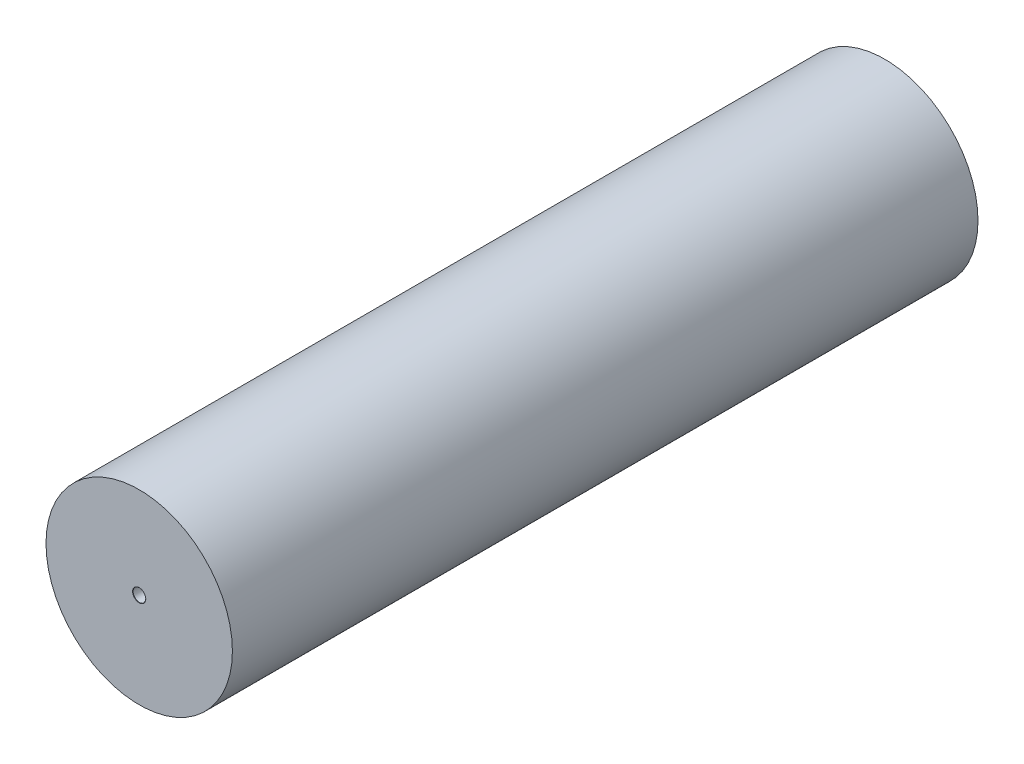
ISO-10303-21;
HEADER;
FILE_DESCRIPTION(('STEP AP214'),'2;1');
FILE_NAME('part.step','',(''),(''),'','','');
FILE_SCHEMA(('AUTOMOTIVE_DESIGN { 1 0 10303 214 1 1 1 1 }'));
ENDSEC;
DATA;
#1=APPLICATION_CONTEXT('core data for automotive mechanical design processes');
#2=APPLICATION_PROTOCOL_DEFINITION('international standard','automotive_design',2000,#1);
#3=PRODUCT_CONTEXT('',#1,'mechanical');
#4=PRODUCT('Part','Part','',(#3));
#5=PRODUCT_RELATED_PRODUCT_CATEGORY('part','',(#4));
#6=PRODUCT_DEFINITION_FORMATION('','',#4);
#7=PRODUCT_DEFINITION_CONTEXT('part definition',#1,'design');
#8=PRODUCT_DEFINITION('design','',#6,#7);
#9=PRODUCT_DEFINITION_SHAPE('','',#8);
#10=(LENGTH_UNIT() NAMED_UNIT(*) SI_UNIT(.MILLI.,.METRE.));
#11=(NAMED_UNIT(*) PLANE_ANGLE_UNIT() SI_UNIT($,.RADIAN.));
#12=(NAMED_UNIT(*) SI_UNIT($,.STERADIAN.) SOLID_ANGLE_UNIT());
#13=UNCERTAINTY_MEASURE_WITH_UNIT(LENGTH_MEASURE(1.E-05),#10,'distance_accuracy_value','');
#14=(GEOMETRIC_REPRESENTATION_CONTEXT(3) GLOBAL_UNCERTAINTY_ASSIGNED_CONTEXT((#13)) GLOBAL_UNIT_ASSIGNED_CONTEXT((#10,
#11,#12)) REPRESENTATION_CONTEXT('',''));
#15=CARTESIAN_POINT('',(0.,0.,0.));
#16=DIRECTION('',(0.,0.,1.));
#17=DIRECTION('',(1.,0.,0.));
#18=AXIS2_PLACEMENT_3D('',#15,#16,#17);
#19=CARTESIAN_POINT('',(0.,0.,1016.));
#20=DIRECTION('',(0.,0.,-1.));
#21=DIRECTION('',(-1.,0.,0.));
#22=AXIS2_PLACEMENT_3D('',#19,#20,#21);
#23=CYLINDRICAL_SURFACE('',#22,127.);
#24=CARTESIAN_POINT('',(0.,0.,1016.));
#25=DIRECTION('',(0.,0.,1.));
#26=DIRECTION('',(1.,0.,0.));
#27=AXIS2_PLACEMENT_3D('',#24,#25,#26);
#28=CIRCLE('',#27,127.);
#29=CARTESIAN_POINT('',(127.,0.,1016.));
#30=VERTEX_POINT('',#29);
#31=EDGE_CURVE('E10',#30,#30,#28,.T.);
#32=ORIENTED_EDGE('',*,*,#31,.F.);
#33=EDGE_LOOP('',(#32));
#34=FACE_BOUND('',#33,.T.);
#35=CARTESIAN_POINT('',(0.,0.,0.));
#36=DIRECTION('',(0.,0.,1.));
#37=DIRECTION('',(1.,0.,0.));
#38=AXIS2_PLACEMENT_3D('',#35,#36,#37);
#39=CIRCLE('',#38,127.);
#40=CARTESIAN_POINT('',(127.,0.,0.));
#41=VERTEX_POINT('',#40);
#42=EDGE_CURVE('E38',#41,#41,#39,.T.);
#43=ORIENTED_EDGE('',*,*,#42,.T.);
#44=EDGE_LOOP('',(#43));
#45=FACE_BOUND('',#44,.T.);
#46=ADVANCED_FACE('F35',(#34,#45),#23,.T.);
#47=CARTESIAN_POINT('',(0.,0.,1016.));
#48=DIRECTION('',(0.,0.,1.));
#49=DIRECTION('',(1.,0.,0.));
#50=AXIS2_PLACEMENT_3D('',#47,#48,#49);
#51=PLANE('',#50);
#52=CARTESIAN_POINT('',(0.,2.35351280787324,1016.));
#53=DIRECTION('',(0.,0.,1.));
#54=DIRECTION('',(1.,0.,0.));
#55=AXIS2_PLACEMENT_3D('',#52,#53,#54);
#56=CIRCLE('',#55,8.955);
#57=CARTESIAN_POINT('',(8.955,2.35351280787324,1016.));
#58=VERTEX_POINT('',#57);
#59=EDGE_CURVE('E58',#58,#58,#56,.T.);
#60=ORIENTED_EDGE('',*,*,#59,.F.);
#61=EDGE_LOOP('',(#60));
#62=FACE_BOUND('',#61,.T.);
#63=ORIENTED_EDGE('',*,*,#31,.T.);
#64=EDGE_LOOP('',(#63));
#65=FACE_BOUND('',#64,.T.);
#66=ADVANCED_FACE('F64',(#62,#65),#51,.T.);
#67=CARTESIAN_POINT('',(0.,0.,0.));
#68=DIRECTION('',(0.,0.,1.));
#69=DIRECTION('',(1.,0.,0.));
#70=AXIS2_PLACEMENT_3D('',#67,#68,#69);
#71=PLANE('',#70);
#72=CARTESIAN_POINT('',(0.,2.35351280787324,0.));
#73=DIRECTION('',(0.,0.,1.));
#74=DIRECTION('',(1.,0.,0.));
#75=AXIS2_PLACEMENT_3D('',#72,#73,#74);
#76=CIRCLE('',#75,24.9999999999999);
#77=CARTESIAN_POINT('',(24.9999999999999,2.35351280787324,0.));
#78=VERTEX_POINT('',#77);
#79=EDGE_CURVE('E45',#78,#78,#76,.T.);
#80=ORIENTED_EDGE('',*,*,#79,.T.);
#81=EDGE_LOOP('',(#80));
#82=FACE_BOUND('',#81,.T.);
#83=ORIENTED_EDGE('',*,*,#42,.F.);
#84=EDGE_LOOP('',(#83));
#85=FACE_BOUND('',#84,.T.);
#86=ADVANCED_FACE('F66',(#82,#85),#71,.F.);
#87=CARTESIAN_POINT('',(0.,2.35351280787324,1016.));
#88=DIRECTION('',(0.,0.,1.));
#89=DIRECTION('',(1.,0.,0.));
#90=AXIS2_PLACEMENT_3D('',#87,#88,#89);
#91=CYLINDRICAL_SURFACE('',#90,24.9999999999999);
#92=ORIENTED_EDGE('',*,*,#79,.F.);
#93=EDGE_LOOP('',(#92));
#94=FACE_BOUND('',#93,.T.);
#95=CARTESIAN_POINT('',(0.,2.35351280787324,995.68));
#96=DIRECTION('',(0.,0.,1.));
#97=DIRECTION('',(1.,0.,0.));
#98=AXIS2_PLACEMENT_3D('',#95,#96,#97);
#99=CIRCLE('',#98,25.);
#100=CARTESIAN_POINT('',(25.,2.35351280787324,995.68));
#101=VERTEX_POINT('',#100);
#102=EDGE_CURVE('E49',#101,#101,#99,.T.);
#103=ORIENTED_EDGE('',*,*,#102,.T.);
#104=EDGE_LOOP('',(#103));
#105=FACE_BOUND('',#104,.T.);
#106=ADVANCED_FACE('F72',(#94,#105),#91,.F.);
#107=CARTESIAN_POINT('',(25.,2.35351280787324,995.68));
#108=DIRECTION('',(0.,0.,1.));
#109=DIRECTION('',(1.,0.,0.));
#110=AXIS2_PLACEMENT_3D('',#107,#108,#109);
#111=PLANE('',#110);
#112=ORIENTED_EDGE('',*,*,#102,.F.);
#113=EDGE_LOOP('',(#112));
#114=FACE_BOUND('',#113,.T.);
#115=CARTESIAN_POINT('',(0.,2.35351280787324,995.68));
#116=DIRECTION('',(0.,0.,1.));
#117=DIRECTION('',(1.,0.,0.));
#118=AXIS2_PLACEMENT_3D('',#115,#116,#117);
#119=CIRCLE('',#118,7.9859175853204);
#120=CARTESIAN_POINT('',(7.9859175853204,2.35351280787324,995.68));
#121=VERTEX_POINT('',#120);
#122=EDGE_CURVE('E52',#121,#121,#119,.T.);
#123=ORIENTED_EDGE('',*,*,#122,.T.);
#124=EDGE_LOOP('',(#123));
#125=FACE_BOUND('',#124,.T.);
#126=ADVANCED_FACE('F78',(#114,#125),#111,.F.);
#127=CARTESIAN_POINT('',(0.,2.35351280787324,1015.6544525));
#128=DIRECTION('',(0.,0.,1.));
#129=DIRECTION('',(1.,0.,0.));
#130=AXIS2_PLACEMENT_3D('',#127,#128,#129);
#131=CONICAL_SURFACE('',#130,8.6094525,0.031206487025659);
#132=ORIENTED_EDGE('',*,*,#122,.F.);
#133=EDGE_LOOP('',(#132));
#134=FACE_BOUND('',#133,.T.);
#135=CARTESIAN_POINT('',(0.,2.35351280787324,1015.6544525));
#136=DIRECTION('',(0.,0.,1.));
#137=DIRECTION('',(1.,0.,0.));
#138=AXIS2_PLACEMENT_3D('',#135,#136,#137);
#139=CIRCLE('',#138,8.6094525);
#140=CARTESIAN_POINT('',(8.6094525,2.35351280787324,1015.6544525));
#141=VERTEX_POINT('',#140);
#142=EDGE_CURVE('E55',#141,#141,#139,.T.);
#143=ORIENTED_EDGE('',*,*,#142,.T.);
#144=EDGE_LOOP('',(#143));
#145=FACE_BOUND('',#144,.T.);
#146=ADVANCED_FACE('F82',(#134,#145),#131,.F.);
#147=CARTESIAN_POINT('',(0.,2.35351280787324,1016.));
#148=DIRECTION('',(0.,0.,1.));
#149=DIRECTION('',(1.,0.,0.));
#150=AXIS2_PLACEMENT_3D('',#147,#148,#149);
#151=CONICAL_SURFACE('',#150,8.955,0.785398163397386);
#152=ORIENTED_EDGE('',*,*,#142,.F.);
#153=EDGE_LOOP('',(#152));
#154=FACE_BOUND('',#153,.T.);
#155=ORIENTED_EDGE('',*,*,#59,.T.);
#156=EDGE_LOOP('',(#155));
#157=FACE_BOUND('',#156,.T.);
#158=ADVANCED_FACE('F62',(#154,#157),#151,.F.);
#159=CLOSED_SHELL('',(#46,#66,#86,#106,#126,#146,#158));
#160=MANIFOLD_SOLID_BREP('B2',#159);
#161=ADVANCED_BREP_SHAPE_REPRESENTATION('',(#18,#160),#14);
#162=SHAPE_DEFINITION_REPRESENTATION(#9,#161);
ENDSEC;
END-ISO-10303-21;
